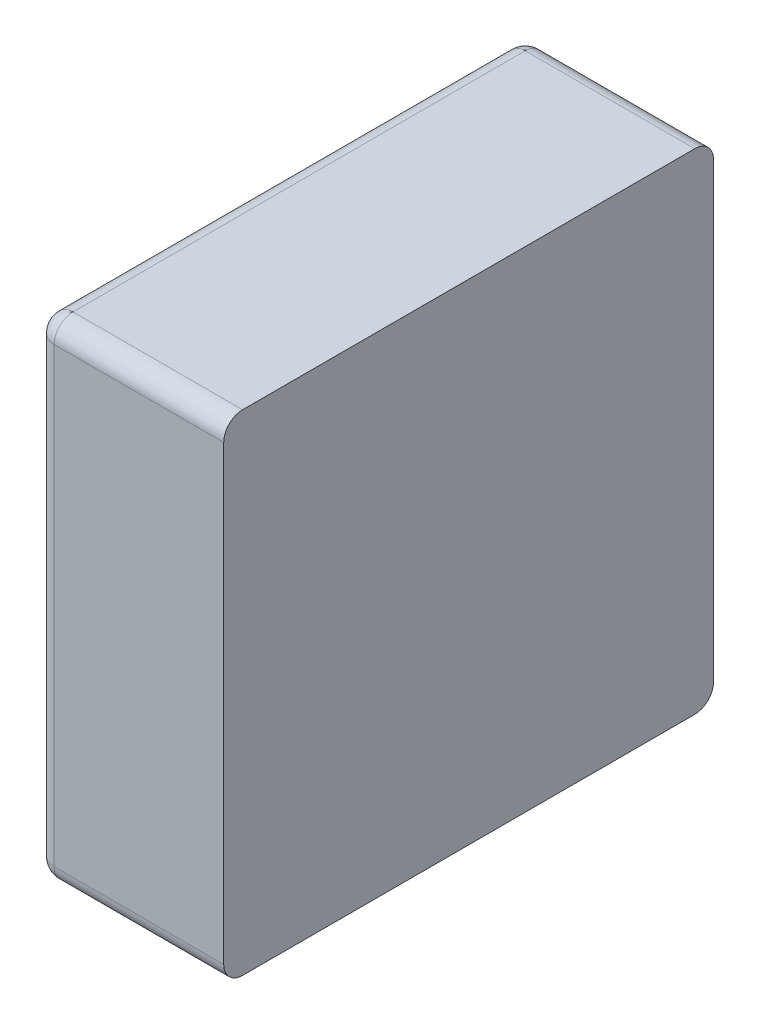
ISO-10303-21;
HEADER;
FILE_DESCRIPTION(('STEP AP214'),'2;1');
FILE_NAME('part.step','',(''),(''),'','','');
FILE_SCHEMA(('AUTOMOTIVE_DESIGN { 1 0 10303 214 1 1 1 1 }'));
ENDSEC;
DATA;
#1=APPLICATION_CONTEXT('core data for automotive mechanical design processes');
#2=APPLICATION_PROTOCOL_DEFINITION('international standard','automotive_design',2000,#1);
#3=PRODUCT_CONTEXT('',#1,'mechanical');
#4=PRODUCT('Part','Part','',(#3));
#5=PRODUCT_RELATED_PRODUCT_CATEGORY('part','',(#4));
#6=PRODUCT_DEFINITION_FORMATION('','',#4);
#7=PRODUCT_DEFINITION_CONTEXT('part definition',#1,'design');
#8=PRODUCT_DEFINITION('design','',#6,#7);
#9=PRODUCT_DEFINITION_SHAPE('','',#8);
#10=(LENGTH_UNIT() NAMED_UNIT(*) SI_UNIT(.MILLI.,.METRE.));
#11=(NAMED_UNIT(*) PLANE_ANGLE_UNIT() SI_UNIT($,.RADIAN.));
#12=(NAMED_UNIT(*) SI_UNIT($,.STERADIAN.) SOLID_ANGLE_UNIT());
#13=UNCERTAINTY_MEASURE_WITH_UNIT(LENGTH_MEASURE(1.E-05),#10,'distance_accuracy_value','');
#14=(GEOMETRIC_REPRESENTATION_CONTEXT(3) GLOBAL_UNCERTAINTY_ASSIGNED_CONTEXT((#13)) GLOBAL_UNIT_ASSIGNED_CONTEXT((#10,
#11,#12)) REPRESENTATION_CONTEXT('',''));
#15=CARTESIAN_POINT('',(0.,0.,0.));
#16=DIRECTION('',(0.,0.,1.));
#17=DIRECTION('',(1.,0.,0.));
#18=AXIS2_PLACEMENT_3D('',#15,#16,#17);
#19=CARTESIAN_POINT('',(-0.48,0.24,0.49));
#20=DIRECTION('',(0.,1.,0.));
#21=DIRECTION('',(1.,0.,0.));
#22=AXIS2_PLACEMENT_3D('',#19,#20,#21);
#23=SPHERICAL_SURFACE('',#22,0.02);
#24=CARTESIAN_POINT('',(-0.48,0.24,0.49));
#25=DIRECTION('',(0.,0.,1.));
#26=DIRECTION('',(0.,1.,0.));
#27=AXIS2_PLACEMENT_3D('',#24,#25,#26);
#28=CIRCLE('',#27,0.02);
#29=CARTESIAN_POINT('',(-0.48,0.26,0.49));
#30=VERTEX_POINT('',#29);
#31=CARTESIAN_POINT('',(-0.5,0.24,0.49));
#32=VERTEX_POINT('',#31);
#33=EDGE_CURVE('E86',#30,#32,#28,.T.);
#34=ORIENTED_EDGE('',*,*,#33,.T.);
#35=CARTESIAN_POINT('',(-0.48,0.24,0.49));
#36=DIRECTION('',(0.,1.,0.));
#37=DIRECTION('',(-1.,0.,0.));
#38=AXIS2_PLACEMENT_3D('',#35,#36,#37);
#39=CIRCLE('',#38,0.02);
#40=CARTESIAN_POINT('',(-0.48,0.24,0.51));
#41=VERTEX_POINT('',#40);
#42=EDGE_CURVE('E84',#32,#41,#39,.T.);
#43=ORIENTED_EDGE('',*,*,#42,.T.);
#44=CARTESIAN_POINT('',(-0.48,0.24,0.49));
#45=DIRECTION('',(-1.,0.,0.));
#46=DIRECTION('',(0.,0.,1.));
#47=AXIS2_PLACEMENT_3D('',#44,#45,#46);
#48=CIRCLE('',#47,0.02);
#49=EDGE_CURVE('E26',#41,#30,#48,.T.);
#50=ORIENTED_EDGE('',*,*,#49,.T.);
#51=EDGE_LOOP('',(#34,#43,#50));
#52=FACE_BOUND('',#51,.T.);
#53=ADVANCED_FACE('F17',(#52),#23,.T.);
#54=CARTESIAN_POINT('',(-0.5,-0.26,0.51));
#55=DIRECTION('',(0.,0.,-1.));
#56=DIRECTION('',(0.,-1.,0.));
#57=AXIS2_PLACEMENT_3D('',#54,#55,#56);
#58=PLANE('',#57);
#59=DIRECTION('',(1.,0.,0.));
#60=VECTOR('',#59,1.);
#61=CARTESIAN_POINT('',(-0.48,0.24,0.51));
#62=LINE('',#61,#60);
#63=CARTESIAN_POINT('',(-0.3,0.24,0.51));
#64=VERTEX_POINT('',#63);
#65=EDGE_CURVE('E11',#41,#64,#62,.T.);
#66=ORIENTED_EDGE('',*,*,#65,.F.);
#67=DIRECTION('',(0.,1.,0.));
#68=VECTOR('',#67,1.);
#69=CARTESIAN_POINT('',(-0.48,-0.24,0.51));
#70=LINE('',#69,#68);
#71=CARTESIAN_POINT('',(-0.48,-0.24,0.51));
#72=VERTEX_POINT('',#71);
#73=EDGE_CURVE('E70',#72,#41,#70,.T.);
#74=ORIENTED_EDGE('',*,*,#73,.F.);
#75=DIRECTION('',(-1.,0.,0.));
#76=VECTOR('',#75,1.);
#77=CARTESIAN_POINT('',(-0.3,-0.24,0.51));
#78=LINE('',#77,#76);
#79=CARTESIAN_POINT('',(-0.3,-0.24,0.51));
#80=VERTEX_POINT('',#79);
#81=EDGE_CURVE('E144',#80,#72,#78,.T.);
#82=ORIENTED_EDGE('',*,*,#81,.F.);
#83=DIRECTION('',(0.,-1.,0.));
#84=VECTOR('',#83,1.);
#85=CARTESIAN_POINT('',(-0.3,0.24,0.51));
#86=LINE('',#85,#84);
#87=EDGE_CURVE('E74',#64,#80,#86,.T.);
#88=ORIENTED_EDGE('',*,*,#87,.F.);
#89=EDGE_LOOP('',(#66,#74,#82,#88));
#90=FACE_BOUND('',#89,.T.);
#91=ADVANCED_FACE('F67',(#90),#58,.F.);
#92=CARTESIAN_POINT('',(-0.5,0.24,0.49));
#93=DIRECTION('',(1.,0.,0.));
#94=DIRECTION('',(0.,1.,0.));
#95=AXIS2_PLACEMENT_3D('',#92,#93,#94);
#96=CYLINDRICAL_SURFACE('',#95,0.02);
#97=DIRECTION('',(-1.,0.,0.));
#98=VECTOR('',#97,1.);
#99=CARTESIAN_POINT('',(-0.3,0.26,0.49));
#100=LINE('',#99,#98);
#101=CARTESIAN_POINT('',(-0.3,0.26,0.49));
#102=VERTEX_POINT('',#101);
#103=EDGE_CURVE('E80',#102,#30,#100,.T.);
#104=ORIENTED_EDGE('',*,*,#103,.T.);
#105=ORIENTED_EDGE('',*,*,#49,.F.);
#106=ORIENTED_EDGE('',*,*,#65,.T.);
#107=CARTESIAN_POINT('',(-0.3,0.24,0.49));
#108=DIRECTION('',(1.,0.,0.));
#109=DIRECTION('',(0.,1.,0.));
#110=AXIS2_PLACEMENT_3D('',#107,#108,#109);
#111=CIRCLE('',#110,0.02);
#112=EDGE_CURVE('E125',#102,#64,#111,.T.);
#113=ORIENTED_EDGE('',*,*,#112,.F.);
#114=EDGE_LOOP('',(#104,#105,#106,#113));
#115=FACE_BOUND('',#114,.T.);
#116=ADVANCED_FACE('F78',(#115),#96,.T.);
#117=CARTESIAN_POINT('',(-0.5,0.26,0.51));
#118=DIRECTION('',(0.,-1.,0.));
#119=DIRECTION('',(0.,0.,-1.));
#120=AXIS2_PLACEMENT_3D('',#117,#118,#119);
#121=PLANE('',#120);
#122=DIRECTION('',(1.,0.,0.));
#123=VECTOR('',#122,1.);
#124=CARTESIAN_POINT('',(-0.48,0.26,0.01));
#125=LINE('',#124,#123);
#126=CARTESIAN_POINT('',(-0.48,0.26,0.01));
#127=VERTEX_POINT('',#126);
#128=CARTESIAN_POINT('',(-0.3,0.26,0.01));
#129=VERTEX_POINT('',#128);
#130=EDGE_CURVE('E112',#127,#129,#125,.T.);
#131=ORIENTED_EDGE('',*,*,#130,.F.);
#132=DIRECTION('',(0.,0.,-1.));
#133=VECTOR('',#132,1.);
#134=CARTESIAN_POINT('',(-0.48,0.26,0.49));
#135=LINE('',#134,#133);
#136=EDGE_CURVE('E137',#30,#127,#135,.T.);
#137=ORIENTED_EDGE('',*,*,#136,.F.);
#138=ORIENTED_EDGE('',*,*,#103,.F.);
#139=DIRECTION('',(0.,0.,1.));
#140=VECTOR('',#139,1.);
#141=CARTESIAN_POINT('',(-0.3,0.26,0.01));
#142=LINE('',#141,#140);
#143=EDGE_CURVE('E120',#129,#102,#142,.T.);
#144=ORIENTED_EDGE('',*,*,#143,.F.);
#145=EDGE_LOOP('',(#131,#137,#138,#144));
#146=FACE_BOUND('',#145,.T.);
#147=ADVANCED_FACE('F277',(#146),#121,.F.);
#148=CARTESIAN_POINT('',(-0.48,0.24,0.));
#149=DIRECTION('',(0.,0.,1.));
#150=DIRECTION('',(1.,0.,0.));
#151=AXIS2_PLACEMENT_3D('',#148,#149,#150);
#152=CYLINDRICAL_SURFACE('',#151,0.02);
#153=DIRECTION('',(0.,0.,1.));
#154=VECTOR('',#153,1.);
#155=CARTESIAN_POINT('',(-0.5,0.24,0.01));
#156=LINE('',#155,#154);
#157=CARTESIAN_POINT('',(-0.5,0.24,0.01));
#158=VERTEX_POINT('',#157);
#159=EDGE_CURVE('E138',#158,#32,#156,.T.);
#160=ORIENTED_EDGE('',*,*,#159,.T.);
#161=ORIENTED_EDGE('',*,*,#33,.F.);
#162=ORIENTED_EDGE('',*,*,#136,.T.);
#163=CARTESIAN_POINT('',(-0.48,0.24,0.01));
#164=DIRECTION('',(0.,0.,-1.));
#165=DIRECTION('',(-1.,0.,0.));
#166=AXIS2_PLACEMENT_3D('',#163,#164,#165);
#167=CIRCLE('',#166,0.02);
#168=EDGE_CURVE('E181',#158,#127,#167,.T.);
#169=ORIENTED_EDGE('',*,*,#168,.F.);
#170=EDGE_LOOP('',(#160,#161,#162,#169));
#171=FACE_BOUND('',#170,.T.);
#172=ADVANCED_FACE('F278',(#171),#152,.T.);
#173=CARTESIAN_POINT('',(-0.5,0.,0.));
#174=DIRECTION('',(-1.,0.,0.));
#175=DIRECTION('',(0.,0.,1.));
#176=AXIS2_PLACEMENT_3D('',#173,#174,#175);
#177=PLANE('',#176);
#178=DIRECTION('',(0.,-1.,0.));
#179=VECTOR('',#178,1.);
#180=CARTESIAN_POINT('',(-0.5,0.24,0.49));
#181=LINE('',#180,#179);
#182=CARTESIAN_POINT('',(-0.5,-0.24,0.49));
#183=VERTEX_POINT('',#182);
#184=EDGE_CURVE('E91',#32,#183,#181,.T.);
#185=ORIENTED_EDGE('',*,*,#184,.F.);
#186=ORIENTED_EDGE('',*,*,#159,.F.);
#187=DIRECTION('',(0.,1.,0.));
#188=VECTOR('',#187,1.);
#189=CARTESIAN_POINT('',(-0.5,-0.24,0.01));
#190=LINE('',#189,#188);
#191=CARTESIAN_POINT('',(-0.5,-0.24,0.01));
#192=VERTEX_POINT('',#191);
#193=EDGE_CURVE('E176',#192,#158,#190,.T.);
#194=ORIENTED_EDGE('',*,*,#193,.F.);
#195=DIRECTION('',(0.,0.,-1.));
#196=VECTOR('',#195,1.);
#197=CARTESIAN_POINT('',(-0.5,-0.24,0.49));
#198=LINE('',#197,#196);
#199=EDGE_CURVE('E218',#183,#192,#198,.T.);
#200=ORIENTED_EDGE('',*,*,#199,.F.);
#201=EDGE_LOOP('',(#185,#186,#194,#200));
#202=FACE_BOUND('',#201,.T.);
#203=ADVANCED_FACE('F283',(#202),#177,.T.);
#204=CARTESIAN_POINT('',(-0.48,0.,0.49));
#205=DIRECTION('',(0.,-1.,0.));
#206=DIRECTION('',(1.,0.,0.));
#207=AXIS2_PLACEMENT_3D('',#204,#205,#206);
#208=CYLINDRICAL_SURFACE('',#207,0.02);
#209=ORIENTED_EDGE('',*,*,#73,.T.);
#210=ORIENTED_EDGE('',*,*,#42,.F.);
#211=ORIENTED_EDGE('',*,*,#184,.T.);
#212=CARTESIAN_POINT('',(-0.48,-0.24,0.49));
#213=DIRECTION('',(0.,-1.,0.));
#214=DIRECTION('',(0.,0.,1.));
#215=AXIS2_PLACEMENT_3D('',#212,#213,#214);
#216=CIRCLE('',#215,0.02);
#217=EDGE_CURVE('E95',#72,#183,#216,.T.);
#218=ORIENTED_EDGE('',*,*,#217,.F.);
#219=EDGE_LOOP('',(#209,#210,#211,#218));
#220=FACE_BOUND('',#219,.T.);
#221=ADVANCED_FACE('F93',(#220),#208,.T.);
#222=CARTESIAN_POINT('',(-0.48,-0.24,0.49));
#223=DIRECTION('',(0.,1.,0.));
#224=DIRECTION('',(1.,0.,0.));
#225=AXIS2_PLACEMENT_3D('',#222,#223,#224);
#226=SPHERICAL_SURFACE('',#225,0.02);
#227=CARTESIAN_POINT('',(-0.48,-0.24,0.49));
#228=DIRECTION('',(-1.,0.,0.));
#229=DIRECTION('',(0.,-1.,0.));
#230=AXIS2_PLACEMENT_3D('',#227,#228,#229);
#231=CIRCLE('',#230,0.02);
#232=CARTESIAN_POINT('',(-0.48,-0.26,0.49));
#233=VERTEX_POINT('',#232);
#234=EDGE_CURVE('E103',#233,#72,#231,.T.);
#235=ORIENTED_EDGE('',*,*,#234,.T.);
#236=ORIENTED_EDGE('',*,*,#217,.T.);
#237=CARTESIAN_POINT('',(-0.48,-0.24,0.49));
#238=DIRECTION('',(0.,0.,1.));
#239=DIRECTION('',(-1.,0.,0.));
#240=AXIS2_PLACEMENT_3D('',#237,#238,#239);
#241=CIRCLE('',#240,0.02);
#242=EDGE_CURVE('E214',#183,#233,#241,.T.);
#243=ORIENTED_EDGE('',*,*,#242,.T.);
#244=EDGE_LOOP('',(#235,#236,#243));
#245=FACE_BOUND('',#244,.T.);
#246=ADVANCED_FACE('F290',(#245),#226,.T.);
#247=CARTESIAN_POINT('',(-0.5,-0.24,0.49));
#248=DIRECTION('',(1.,0.,0.));
#249=DIRECTION('',(0.,1.,0.));
#250=AXIS2_PLACEMENT_3D('',#247,#248,#249);
#251=CYLINDRICAL_SURFACE('',#250,0.02);
#252=ORIENTED_EDGE('',*,*,#81,.T.);
#253=ORIENTED_EDGE('',*,*,#234,.F.);
#254=DIRECTION('',(1.,0.,0.));
#255=VECTOR('',#254,1.);
#256=CARTESIAN_POINT('',(-0.48,-0.26,0.49));
#257=LINE('',#256,#255);
#258=CARTESIAN_POINT('',(-0.3,-0.26,0.49));
#259=VERTEX_POINT('',#258);
#260=EDGE_CURVE('E141',#233,#259,#257,.T.);
#261=ORIENTED_EDGE('',*,*,#260,.T.);
#262=CARTESIAN_POINT('',(-0.3,-0.24,0.49));
#263=DIRECTION('',(1.,0.,0.));
#264=DIRECTION('',(0.,0.,1.));
#265=AXIS2_PLACEMENT_3D('',#262,#263,#264);
#266=CIRCLE('',#265,0.02);
#267=EDGE_CURVE('E124',#80,#259,#266,.T.);
#268=ORIENTED_EDGE('',*,*,#267,.F.);
#269=EDGE_LOOP('',(#252,#253,#261,#268));
#270=FACE_BOUND('',#269,.T.);
#271=ADVANCED_FACE('F253',(#270),#251,.T.);
#272=CARTESIAN_POINT('',(-0.5,-0.26,-0.01));
#273=DIRECTION('',(0.,1.,0.));
#274=DIRECTION('',(1.,0.,0.));
#275=AXIS2_PLACEMENT_3D('',#272,#273,#274);
#276=PLANE('',#275);
#277=DIRECTION('',(-1.,0.,0.));
#278=VECTOR('',#277,1.);
#279=CARTESIAN_POINT('',(-0.3,-0.26,0.01));
#280=LINE('',#279,#278);
#281=CARTESIAN_POINT('',(-0.3,-0.26,0.01));
#282=VERTEX_POINT('',#281);
#283=CARTESIAN_POINT('',(-0.48,-0.26,0.01));
#284=VERTEX_POINT('',#283);
#285=EDGE_CURVE('E145',#282,#284,#280,.T.);
#286=ORIENTED_EDGE('',*,*,#285,.F.);
#287=DIRECTION('',(0.,0.,-1.));
#288=VECTOR('',#287,1.);
#289=CARTESIAN_POINT('',(-0.3,-0.26,0.49));
#290=LINE('',#289,#288);
#291=EDGE_CURVE('E126',#259,#282,#290,.T.);
#292=ORIENTED_EDGE('',*,*,#291,.F.);
#293=ORIENTED_EDGE('',*,*,#260,.F.);
#294=DIRECTION('',(0.,0.,1.));
#295=VECTOR('',#294,1.);
#296=CARTESIAN_POINT('',(-0.48,-0.26,0.01));
#297=LINE('',#296,#295);
#298=EDGE_CURVE('E213',#284,#233,#297,.T.);
#299=ORIENTED_EDGE('',*,*,#298,.F.);
#300=EDGE_LOOP('',(#286,#292,#293,#299));
#301=FACE_BOUND('',#300,.T.);
#302=ADVANCED_FACE('F258',(#301),#276,.F.);
#303=CARTESIAN_POINT('',(-0.5,-0.24,0.01));
#304=DIRECTION('',(1.,0.,0.));
#305=DIRECTION('',(0.,1.,0.));
#306=AXIS2_PLACEMENT_3D('',#303,#304,#305);
#307=CYLINDRICAL_SURFACE('',#306,0.02);
#308=ORIENTED_EDGE('',*,*,#285,.T.);
#309=CARTESIAN_POINT('',(-0.48,-0.24,0.01));
#310=DIRECTION('',(-1.,0.,0.));
#311=DIRECTION('',(0.,0.,-1.));
#312=AXIS2_PLACEMENT_3D('',#309,#310,#311);
#313=CIRCLE('',#312,0.02);
#314=CARTESIAN_POINT('',(-0.48,-0.24,-0.01));
#315=VERTEX_POINT('',#314);
#316=EDGE_CURVE('E209',#315,#284,#313,.T.);
#317=ORIENTED_EDGE('',*,*,#316,.F.);
#318=DIRECTION('',(1.,0.,0.));
#319=VECTOR('',#318,1.);
#320=CARTESIAN_POINT('',(-0.48,-0.24,-0.01));
#321=LINE('',#320,#319);
#322=CARTESIAN_POINT('',(-0.3,-0.24,-0.01));
#323=VERTEX_POINT('',#322);
#324=EDGE_CURVE('E149',#315,#323,#321,.T.);
#325=ORIENTED_EDGE('',*,*,#324,.T.);
#326=CARTESIAN_POINT('',(-0.3,-0.24,0.01));
#327=DIRECTION('',(1.,0.,0.));
#328=DIRECTION('',(0.,-1.,0.));
#329=AXIS2_PLACEMENT_3D('',#326,#327,#328);
#330=CIRCLE('',#329,0.02);
#331=EDGE_CURVE('E130',#282,#323,#330,.T.);
#332=ORIENTED_EDGE('',*,*,#331,.F.);
#333=EDGE_LOOP('',(#308,#317,#325,#332));
#334=FACE_BOUND('',#333,.T.);
#335=ADVANCED_FACE('F265',(#334),#307,.T.);
#336=CARTESIAN_POINT('',(-0.5,0.26,-0.01));
#337=DIRECTION('',(0.,0.,1.));
#338=DIRECTION('',(1.,0.,0.));
#339=AXIS2_PLACEMENT_3D('',#336,#337,#338);
#340=PLANE('',#339);
#341=DIRECTION('',(-1.,0.,0.));
#342=VECTOR('',#341,1.);
#343=CARTESIAN_POINT('',(-0.3,0.24,-0.01));
#344=LINE('',#343,#342);
#345=CARTESIAN_POINT('',(-0.3,0.24,-0.01));
#346=VERTEX_POINT('',#345);
#347=CARTESIAN_POINT('',(-0.48,0.24,-0.01));
#348=VERTEX_POINT('',#347);
#349=EDGE_CURVE('E109',#346,#348,#344,.T.);
#350=ORIENTED_EDGE('',*,*,#349,.F.);
#351=DIRECTION('',(0.,1.,0.));
#352=VECTOR('',#351,1.);
#353=CARTESIAN_POINT('',(-0.3,-0.24,-0.01));
#354=LINE('',#353,#352);
#355=EDGE_CURVE('E134',#323,#346,#354,.T.);
#356=ORIENTED_EDGE('',*,*,#355,.F.);
#357=ORIENTED_EDGE('',*,*,#324,.F.);
#358=DIRECTION('',(0.,-1.,0.));
#359=VECTOR('',#358,1.);
#360=CARTESIAN_POINT('',(-0.48,0.24,-0.01));
#361=LINE('',#360,#359);
#362=EDGE_CURVE('E193',#348,#315,#361,.T.);
#363=ORIENTED_EDGE('',*,*,#362,.F.);
#364=EDGE_LOOP('',(#350,#356,#357,#363));
#365=FACE_BOUND('',#364,.T.);
#366=ADVANCED_FACE('F271',(#365),#340,.F.);
#367=CARTESIAN_POINT('',(-0.3,0.,0.));
#368=DIRECTION('',(-1.,0.,0.));
#369=DIRECTION('',(0.,0.,1.));
#370=AXIS2_PLACEMENT_3D('',#367,#368,#369);
#371=PLANE('',#370);
#372=CARTESIAN_POINT('',(-0.3,0.24,0.01));
#373=DIRECTION('',(1.,0.,0.));
#374=DIRECTION('',(0.,0.,-1.));
#375=AXIS2_PLACEMENT_3D('',#372,#373,#374);
#376=CIRCLE('',#375,0.02);
#377=EDGE_CURVE('E117',#346,#129,#376,.T.);
#378=ORIENTED_EDGE('',*,*,#377,.T.);
#379=ORIENTED_EDGE('',*,*,#143,.T.);
#380=ORIENTED_EDGE('',*,*,#112,.T.);
#381=ORIENTED_EDGE('',*,*,#87,.T.);
#382=ORIENTED_EDGE('',*,*,#267,.T.);
#383=ORIENTED_EDGE('',*,*,#291,.T.);
#384=ORIENTED_EDGE('',*,*,#331,.T.);
#385=ORIENTED_EDGE('',*,*,#355,.T.);
#386=EDGE_LOOP('',(#378,#379,#380,#381,#382,#383,#384,#385));
#387=FACE_BOUND('',#386,.T.);
#388=ADVANCED_FACE('F238',(#387),#371,.F.);
#389=CARTESIAN_POINT('',(-0.5,0.24,0.01));
#390=DIRECTION('',(1.,0.,0.));
#391=DIRECTION('',(0.,1.,0.));
#392=AXIS2_PLACEMENT_3D('',#389,#390,#391);
#393=CYLINDRICAL_SURFACE('',#392,0.02);
#394=ORIENTED_EDGE('',*,*,#349,.T.);
#395=CARTESIAN_POINT('',(-0.48,0.24,0.01));
#396=DIRECTION('',(-1.,0.,0.));
#397=DIRECTION('',(0.,1.,0.));
#398=AXIS2_PLACEMENT_3D('',#395,#396,#397);
#399=CIRCLE('',#398,0.02);
#400=EDGE_CURVE('E107',#127,#348,#399,.T.);
#401=ORIENTED_EDGE('',*,*,#400,.F.);
#402=ORIENTED_EDGE('',*,*,#130,.T.);
#403=ORIENTED_EDGE('',*,*,#377,.F.);
#404=EDGE_LOOP('',(#394,#401,#402,#403));
#405=FACE_BOUND('',#404,.T.);
#406=ADVANCED_FACE('F274',(#405),#393,.T.);
#407=CARTESIAN_POINT('',(-0.48,0.24,0.01));
#408=DIRECTION('',(0.,1.,0.));
#409=DIRECTION('',(1.,0.,0.));
#410=AXIS2_PLACEMENT_3D('',#407,#408,#409);
#411=SPHERICAL_SURFACE('',#410,0.02);
#412=CARTESIAN_POINT('',(-0.48,0.24,0.01));
#413=DIRECTION('',(0.,1.,0.));
#414=DIRECTION('',(0.,0.,-1.));
#415=AXIS2_PLACEMENT_3D('',#412,#413,#414);
#416=CIRCLE('',#415,0.02);
#417=EDGE_CURVE('E178',#348,#158,#416,.T.);
#418=ORIENTED_EDGE('',*,*,#417,.T.);
#419=ORIENTED_EDGE('',*,*,#168,.T.);
#420=ORIENTED_EDGE('',*,*,#400,.T.);
#421=EDGE_LOOP('',(#418,#419,#420));
#422=FACE_BOUND('',#421,.T.);
#423=ADVANCED_FACE('F464',(#422),#411,.T.);
#424=CARTESIAN_POINT('',(-0.48,0.,0.01));
#425=DIRECTION('',(0.,1.,0.));
#426=DIRECTION('',(-1.,0.,0.));
#427=AXIS2_PLACEMENT_3D('',#424,#425,#426);
#428=CYLINDRICAL_SURFACE('',#427,0.02);
#429=ORIENTED_EDGE('',*,*,#362,.T.);
#430=CARTESIAN_POINT('',(-0.48,-0.24,0.01));
#431=DIRECTION('',(0.,-1.,0.));
#432=DIRECTION('',(-1.,0.,0.));
#433=AXIS2_PLACEMENT_3D('',#430,#431,#432);
#434=CIRCLE('',#433,0.02);
#435=EDGE_CURVE('E201',#192,#315,#434,.T.);
#436=ORIENTED_EDGE('',*,*,#435,.F.);
#437=ORIENTED_EDGE('',*,*,#193,.T.);
#438=ORIENTED_EDGE('',*,*,#417,.F.);
#439=EDGE_LOOP('',(#429,#436,#437,#438));
#440=FACE_BOUND('',#439,.T.);
#441=ADVANCED_FACE('F313',(#440),#428,.T.);
#442=CARTESIAN_POINT('',(-0.48,-0.24,0.01));
#443=DIRECTION('',(0.,1.,0.));
#444=DIRECTION('',(1.,0.,0.));
#445=AXIS2_PLACEMENT_3D('',#442,#443,#444);
#446=SPHERICAL_SURFACE('',#445,0.02);
#447=ORIENTED_EDGE('',*,*,#316,.T.);
#448=CARTESIAN_POINT('',(-0.48,-0.24,0.01));
#449=DIRECTION('',(0.,0.,-1.));
#450=DIRECTION('',(0.,-1.,0.));
#451=AXIS2_PLACEMENT_3D('',#448,#449,#450);
#452=CIRCLE('',#451,0.02);
#453=EDGE_CURVE('E222',#284,#192,#452,.T.);
#454=ORIENTED_EDGE('',*,*,#453,.T.);
#455=ORIENTED_EDGE('',*,*,#435,.T.);
#456=EDGE_LOOP('',(#447,#454,#455));
#457=FACE_BOUND('',#456,.T.);
#458=ADVANCED_FACE('F316',(#457),#446,.T.);
#459=CARTESIAN_POINT('',(-0.48,-0.24,0.));
#460=DIRECTION('',(0.,0.,-1.));
#461=DIRECTION('',(-1.,0.,0.));
#462=AXIS2_PLACEMENT_3D('',#459,#460,#461);
#463=CYLINDRICAL_SURFACE('',#462,0.02);
#464=ORIENTED_EDGE('',*,*,#298,.T.);
#465=ORIENTED_EDGE('',*,*,#242,.F.);
#466=ORIENTED_EDGE('',*,*,#199,.T.);
#467=ORIENTED_EDGE('',*,*,#453,.F.);
#468=EDGE_LOOP('',(#464,#465,#466,#467));
#469=FACE_BOUND('',#468,.T.);
#470=ADVANCED_FACE('F318',(#469),#463,.T.);
#471=CLOSED_SHELL('',(#53,#91,#116,#147,#172,#203,#221,#246,#271,#302,#335,#366,#388,#406,#423,
#441,#458,#470));
#472=MANIFOLD_SOLID_BREP('B1',#471);
#473=ADVANCED_BREP_SHAPE_REPRESENTATION('',(#18,#472),#14);
#474=SHAPE_DEFINITION_REPRESENTATION(#9,#473);
ENDSEC;
END-ISO-10303-21;
